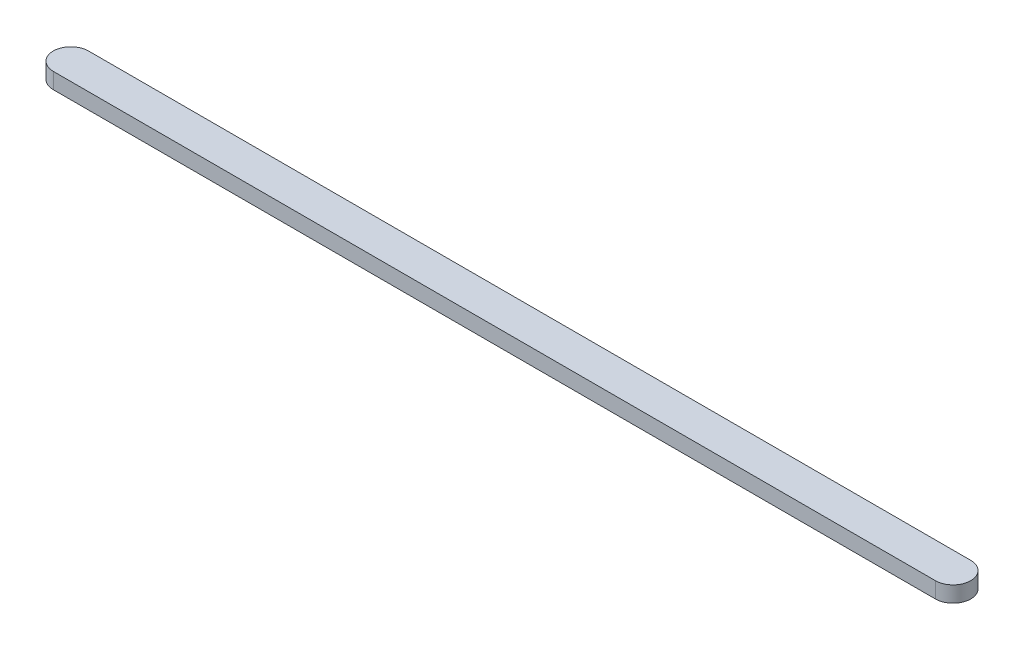
ISO-10303-21;
HEADER;
FILE_DESCRIPTION(('STEP AP214'),'2;1');
FILE_NAME('part.step','',(''),(''),'','','');
FILE_SCHEMA(('AUTOMOTIVE_DESIGN { 1 0 10303 214 1 1 1 1 }'));
ENDSEC;
DATA;
#1=APPLICATION_CONTEXT('core data for automotive mechanical design processes');
#2=APPLICATION_PROTOCOL_DEFINITION('international standard','automotive_design',2000,#1);
#3=PRODUCT_CONTEXT('',#1,'mechanical');
#4=PRODUCT('Part','Part','',(#3));
#5=PRODUCT_RELATED_PRODUCT_CATEGORY('part','',(#4));
#6=PRODUCT_DEFINITION_FORMATION('','',#4);
#7=PRODUCT_DEFINITION_CONTEXT('part definition',#1,'design');
#8=PRODUCT_DEFINITION('design','',#6,#7);
#9=PRODUCT_DEFINITION_SHAPE('','',#8);
#10=(LENGTH_UNIT() NAMED_UNIT(*) SI_UNIT(.MILLI.,.METRE.));
#11=(NAMED_UNIT(*) PLANE_ANGLE_UNIT() SI_UNIT($,.RADIAN.));
#12=(NAMED_UNIT(*) SI_UNIT($,.STERADIAN.) SOLID_ANGLE_UNIT());
#13=UNCERTAINTY_MEASURE_WITH_UNIT(LENGTH_MEASURE(1.E-05),#10,'distance_accuracy_value','');
#14=(GEOMETRIC_REPRESENTATION_CONTEXT(3) GLOBAL_UNCERTAINTY_ASSIGNED_CONTEXT((#13)) GLOBAL_UNIT_ASSIGNED_CONTEXT((#10,
#11,#12)) REPRESENTATION_CONTEXT('',''));
#15=CARTESIAN_POINT('',(0.,0.,0.));
#16=DIRECTION('',(0.,0.,1.));
#17=DIRECTION('',(1.,0.,0.));
#18=AXIS2_PLACEMENT_3D('',#15,#16,#17);
#19=CARTESIAN_POINT('',(-100.,4.5,0.));
#20=DIRECTION('',(0.,-1.,0.));
#21=DIRECTION('',(0.,0.,-1.));
#22=AXIS2_PLACEMENT_3D('',#19,#20,#21);
#23=CYLINDRICAL_SURFACE('',#22,5.);
#24=CARTESIAN_POINT('',(-100.,0.,0.));
#25=DIRECTION('',(0.,1.,0.));
#26=DIRECTION('',(0.,0.,1.));
#27=AXIS2_PLACEMENT_3D('',#24,#25,#26);
#28=CIRCLE('',#27,5.);
#29=CARTESIAN_POINT('',(-100.,0.,-5.));
#30=VERTEX_POINT('',#29);
#31=CARTESIAN_POINT('',(-100.,0.,5.));
#32=VERTEX_POINT('',#31);
#33=EDGE_CURVE('E103',#30,#32,#28,.T.);
#34=ORIENTED_EDGE('',*,*,#33,.T.);
#35=DIRECTION('',(0.,-1.,0.));
#36=VECTOR('',#35,1.);
#37=CARTESIAN_POINT('',(-100.,4.5,5.));
#38=LINE('',#37,#36);
#39=CARTESIAN_POINT('',(-100.,4.5,5.));
#40=VERTEX_POINT('',#39);
#41=EDGE_CURVE('E11',#40,#32,#38,.T.);
#42=ORIENTED_EDGE('',*,*,#41,.F.);
#43=CARTESIAN_POINT('',(-100.,4.5,0.));
#44=DIRECTION('',(0.,1.,0.));
#45=DIRECTION('',(0.,0.,1.));
#46=AXIS2_PLACEMENT_3D('',#43,#44,#45);
#47=CIRCLE('',#46,5.);
#48=CARTESIAN_POINT('',(-100.,4.5,-5.));
#49=VERTEX_POINT('',#48);
#50=EDGE_CURVE('E91',#49,#40,#47,.T.);
#51=ORIENTED_EDGE('',*,*,#50,.F.);
#52=DIRECTION('',(0.,-1.,0.));
#53=VECTOR('',#52,1.);
#54=CARTESIAN_POINT('',(-100.,4.5,-5.));
#55=LINE('',#54,#53);
#56=EDGE_CURVE('E99',#49,#30,#55,.T.);
#57=ORIENTED_EDGE('',*,*,#56,.T.);
#58=EDGE_LOOP('',(#34,#42,#51,#57));
#59=FACE_BOUND('',#58,.T.);
#60=ADVANCED_FACE('F40',(#59),#23,.T.);
#61=CARTESIAN_POINT('',(-100.,4.5,5.));
#62=DIRECTION('',(0.,0.,-1.));
#63=DIRECTION('',(-1.,0.,0.));
#64=AXIS2_PLACEMENT_3D('',#61,#62,#63);
#65=PLANE('',#64);
#66=DIRECTION('',(1.,0.,0.));
#67=VECTOR('',#66,1.);
#68=CARTESIAN_POINT('',(-100.,0.,5.));
#69=LINE('',#68,#67);
#70=CARTESIAN_POINT('',(150.,0.,5.));
#71=VERTEX_POINT('',#70);
#72=EDGE_CURVE('E95',#32,#71,#69,.T.);
#73=ORIENTED_EDGE('',*,*,#72,.T.);
#74=DIRECTION('',(0.,-1.,0.));
#75=VECTOR('',#74,1.);
#76=CARTESIAN_POINT('',(150.,4.5,5.));
#77=LINE('',#76,#75);
#78=CARTESIAN_POINT('',(150.,4.5,5.));
#79=VERTEX_POINT('',#78);
#80=EDGE_CURVE('E48',#79,#71,#77,.T.);
#81=ORIENTED_EDGE('',*,*,#80,.F.);
#82=DIRECTION('',(1.,0.,0.));
#83=VECTOR('',#82,1.);
#84=CARTESIAN_POINT('',(-100.,4.5,5.));
#85=LINE('',#84,#83);
#86=EDGE_CURVE('E86',#40,#79,#85,.T.);
#87=ORIENTED_EDGE('',*,*,#86,.F.);
#88=ORIENTED_EDGE('',*,*,#41,.T.);
#89=EDGE_LOOP('',(#73,#81,#87,#88));
#90=FACE_BOUND('',#89,.T.);
#91=ADVANCED_FACE('F94',(#90),#65,.F.);
#92=CARTESIAN_POINT('',(150.,4.5,0.));
#93=DIRECTION('',(0.,-1.,0.));
#94=DIRECTION('',(0.,0.,-1.));
#95=AXIS2_PLACEMENT_3D('',#92,#93,#94);
#96=CYLINDRICAL_SURFACE('',#95,5.);
#97=CARTESIAN_POINT('',(150.,0.,0.));
#98=DIRECTION('',(0.,1.,0.));
#99=DIRECTION('',(0.,0.,1.));
#100=AXIS2_PLACEMENT_3D('',#97,#98,#99);
#101=CIRCLE('',#100,5.);
#102=CARTESIAN_POINT('',(150.,0.,-5.));
#103=VERTEX_POINT('',#102);
#104=EDGE_CURVE('E73',#71,#103,#101,.T.);
#105=ORIENTED_EDGE('',*,*,#104,.T.);
#106=DIRECTION('',(0.,-1.,0.));
#107=VECTOR('',#106,1.);
#108=CARTESIAN_POINT('',(150.,4.5,-5.));
#109=LINE('',#108,#107);
#110=CARTESIAN_POINT('',(150.,4.5,-5.));
#111=VERTEX_POINT('',#110);
#112=EDGE_CURVE('E96',#111,#103,#109,.T.);
#113=ORIENTED_EDGE('',*,*,#112,.F.);
#114=CARTESIAN_POINT('',(150.,4.5,0.));
#115=DIRECTION('',(0.,1.,0.));
#116=DIRECTION('',(0.,0.,1.));
#117=AXIS2_PLACEMENT_3D('',#114,#115,#116);
#118=CIRCLE('',#117,5.);
#119=EDGE_CURVE('E89',#79,#111,#118,.T.);
#120=ORIENTED_EDGE('',*,*,#119,.F.);
#121=ORIENTED_EDGE('',*,*,#80,.T.);
#122=EDGE_LOOP('',(#105,#113,#120,#121));
#123=FACE_BOUND('',#122,.T.);
#124=ADVANCED_FACE('F97',(#123),#96,.T.);
#125=CARTESIAN_POINT('',(-100.,4.5,-5.));
#126=DIRECTION('',(0.,0.,1.));
#127=DIRECTION('',(1.,0.,0.));
#128=AXIS2_PLACEMENT_3D('',#125,#126,#127);
#129=PLANE('',#128);
#130=DIRECTION('',(-1.,0.,0.));
#131=VECTOR('',#130,1.);
#132=CARTESIAN_POINT('',(-100.,0.,-5.));
#133=LINE('',#132,#131);
#134=EDGE_CURVE('E79',#103,#30,#133,.T.);
#135=ORIENTED_EDGE('',*,*,#134,.T.);
#136=ORIENTED_EDGE('',*,*,#56,.F.);
#137=DIRECTION('',(-1.,0.,0.));
#138=VECTOR('',#137,1.);
#139=CARTESIAN_POINT('',(-100.,4.5,-5.));
#140=LINE('',#139,#138);
#141=EDGE_CURVE('E56',#111,#49,#140,.T.);
#142=ORIENTED_EDGE('',*,*,#141,.F.);
#143=ORIENTED_EDGE('',*,*,#112,.T.);
#144=EDGE_LOOP('',(#135,#136,#142,#143));
#145=FACE_BOUND('',#144,.T.);
#146=ADVANCED_FACE('F110',(#145),#129,.F.);
#147=CARTESIAN_POINT('',(-100.,4.5,0.));
#148=DIRECTION('',(0.,1.,0.));
#149=DIRECTION('',(0.,0.,1.));
#150=AXIS2_PLACEMENT_3D('',#147,#148,#149);
#151=PLANE('',#150);
#152=ORIENTED_EDGE('',*,*,#50,.T.);
#153=ORIENTED_EDGE('',*,*,#86,.T.);
#154=ORIENTED_EDGE('',*,*,#119,.T.);
#155=ORIENTED_EDGE('',*,*,#141,.T.);
#156=EDGE_LOOP('',(#152,#153,#154,#155));
#157=FACE_BOUND('',#156,.T.);
#158=ADVANCED_FACE('F87',(#157),#151,.T.);
#159=CARTESIAN_POINT('',(-100.,0.,0.));
#160=DIRECTION('',(0.,1.,0.));
#161=DIRECTION('',(0.,0.,1.));
#162=AXIS2_PLACEMENT_3D('',#159,#160,#161);
#163=PLANE('',#162);
#164=ORIENTED_EDGE('',*,*,#33,.F.);
#165=ORIENTED_EDGE('',*,*,#134,.F.);
#166=ORIENTED_EDGE('',*,*,#104,.F.);
#167=ORIENTED_EDGE('',*,*,#72,.F.);
#168=EDGE_LOOP('',(#164,#165,#166,#167));
#169=FACE_BOUND('',#168,.T.);
#170=ADVANCED_FACE('F113',(#169),#163,.F.);
#171=CLOSED_SHELL('',(#60,#91,#124,#146,#158,#170));
#172=MANIFOLD_SOLID_BREP('B2',#171);
#173=ADVANCED_BREP_SHAPE_REPRESENTATION('',(#18,#172),#14);
#174=SHAPE_DEFINITION_REPRESENTATION(#9,#173);
ENDSEC;
END-ISO-10303-21;
